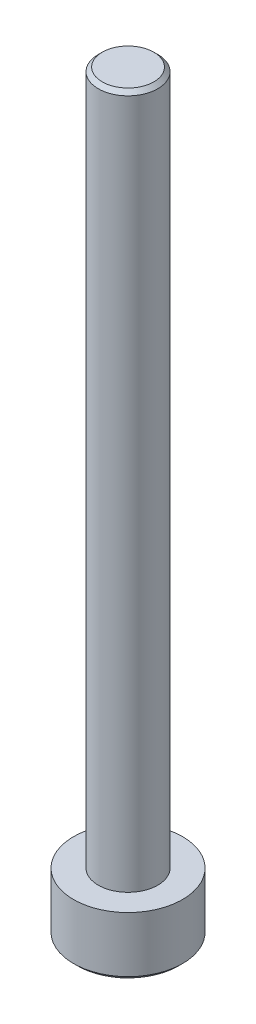
ISO-10303-21;
HEADER;
FILE_DESCRIPTION(('STEP AP214'),'2;1');
FILE_NAME('part.step','',(''),(''),'','','');
FILE_SCHEMA(('AUTOMOTIVE_DESIGN { 1 0 10303 214 1 1 1 1 }'));
ENDSEC;
DATA;
#1=APPLICATION_CONTEXT('core data for automotive mechanical design processes');
#2=APPLICATION_PROTOCOL_DEFINITION('international standard','automotive_design',2000,#1);
#3=PRODUCT_CONTEXT('',#1,'mechanical');
#4=PRODUCT('Part','Part','',(#3));
#5=PRODUCT_RELATED_PRODUCT_CATEGORY('part','',(#4));
#6=PRODUCT_DEFINITION_FORMATION('','',#4);
#7=PRODUCT_DEFINITION_CONTEXT('part definition',#1,'design');
#8=PRODUCT_DEFINITION('design','',#6,#7);
#9=PRODUCT_DEFINITION_SHAPE('','',#8);
#10=(LENGTH_UNIT() NAMED_UNIT(*) SI_UNIT(.MILLI.,.METRE.));
#11=(NAMED_UNIT(*) PLANE_ANGLE_UNIT() SI_UNIT($,.RADIAN.));
#12=(NAMED_UNIT(*) SI_UNIT($,.STERADIAN.) SOLID_ANGLE_UNIT());
#13=UNCERTAINTY_MEASURE_WITH_UNIT(LENGTH_MEASURE(1.E-05),#10,'distance_accuracy_value','');
#14=(GEOMETRIC_REPRESENTATION_CONTEXT(3) GLOBAL_UNCERTAINTY_ASSIGNED_CONTEXT((#13)) GLOBAL_UNIT_ASSIGNED_CONTEXT((#10,
#11,#12)) REPRESENTATION_CONTEXT('',''));
#15=CARTESIAN_POINT('',(0.,0.,0.));
#16=DIRECTION('',(0.,0.,1.));
#17=DIRECTION('',(1.,0.,0.));
#18=AXIS2_PLACEMENT_3D('',#15,#16,#17);
#19=CARTESIAN_POINT('',(0.,-3.,0.));
#20=DIRECTION('',(0.,-1.,0.));
#21=DIRECTION('',(0.,0.,-1.));
#22=AXIS2_PLACEMENT_3D('',#19,#20,#21);
#23=PLANE('',#22);
#24=CARTESIAN_POINT('',(0.,-3.,0.));
#25=DIRECTION('',(0.,-1.,0.));
#26=DIRECTION('',(0.,0.,-1.));
#27=AXIS2_PLACEMENT_3D('',#24,#25,#26);
#28=CIRCLE('',#27,2.55);
#29=CARTESIAN_POINT('',(0.,-3.,-2.55));
#30=VERTEX_POINT('',#29);
#31=EDGE_CURVE('E11',#30,#30,#28,.T.);
#32=ORIENTED_EDGE('',*,*,#31,.T.);
#33=EDGE_LOOP('',(#32));
#34=FACE_BOUND('',#33,.T.);
#35=DIRECTION('',(0.5,0.,-0.866025403784439));
#36=VECTOR('',#35,1.);
#37=CARTESIAN_POINT('',(1.44337567297406,-3.,0.));
#38=LINE('',#37,#36);
#39=CARTESIAN_POINT('',(0.721687836487032,-3.,1.25));
#40=VERTEX_POINT('',#39);
#41=CARTESIAN_POINT('',(1.44337567297406,-3.,0.));
#42=VERTEX_POINT('',#41);
#43=EDGE_CURVE('E127',#40,#42,#38,.T.);
#44=ORIENTED_EDGE('',*,*,#43,.T.);
#45=DIRECTION('',(-0.5,0.,-0.866025403784439));
#46=VECTOR('',#45,1.);
#47=CARTESIAN_POINT('',(0.721687836487032,-3.,-1.25));
#48=LINE('',#47,#46);
#49=CARTESIAN_POINT('',(0.721687836487032,-3.,-1.25));
#50=VERTEX_POINT('',#49);
#51=EDGE_CURVE('E47',#42,#50,#48,.T.);
#52=ORIENTED_EDGE('',*,*,#51,.T.);
#53=DIRECTION('',(-1.,0.,0.));
#54=VECTOR('',#53,1.);
#55=CARTESIAN_POINT('',(-0.721687836487033,-3.,-1.25));
#56=LINE('',#55,#54);
#57=CARTESIAN_POINT('',(-0.721687836487033,-3.,-1.25));
#58=VERTEX_POINT('',#57);
#59=EDGE_CURVE('E118',#50,#58,#56,.T.);
#60=ORIENTED_EDGE('',*,*,#59,.T.);
#61=DIRECTION('',(-0.5,0.,0.866025403784439));
#62=VECTOR('',#61,1.);
#63=CARTESIAN_POINT('',(-1.44337567297406,-3.,0.));
#64=LINE('',#63,#62);
#65=CARTESIAN_POINT('',(-1.44337567297406,-3.,0.));
#66=VERTEX_POINT('',#65);
#67=EDGE_CURVE('E121',#58,#66,#64,.T.);
#68=ORIENTED_EDGE('',*,*,#67,.T.);
#69=DIRECTION('',(0.5,0.,0.866025403784439));
#70=VECTOR('',#69,1.);
#71=CARTESIAN_POINT('',(-0.721687836487032,-3.,1.25));
#72=LINE('',#71,#70);
#73=CARTESIAN_POINT('',(-0.721687836487032,-3.,1.25));
#74=VERTEX_POINT('',#73);
#75=EDGE_CURVE('E124',#66,#74,#72,.T.);
#76=ORIENTED_EDGE('',*,*,#75,.T.);
#77=DIRECTION('',(1.,0.,0.));
#78=VECTOR('',#77,1.);
#79=CARTESIAN_POINT('',(0.721687836487032,-3.,1.25));
#80=LINE('',#79,#78);
#81=EDGE_CURVE('E108',#74,#40,#80,.T.);
#82=ORIENTED_EDGE('',*,*,#81,.T.);
#83=EDGE_LOOP('',(#44,#52,#60,#68,#76,#82));
#84=FACE_BOUND('',#83,.T.);
#85=ADVANCED_FACE('F33',(#34,#84),#23,.T.);
#86=CARTESIAN_POINT('',(0.,-3.,0.));
#87=DIRECTION('',(0.,1.,0.));
#88=DIRECTION('',(0.,0.,1.));
#89=AXIS2_PLACEMENT_3D('',#86,#87,#88);
#90=CONICAL_SURFACE('',#89,2.55,0.785398163397504);
#91=CARTESIAN_POINT('',(0.,-2.80000000000002,0.));
#92=DIRECTION('',(0.,-1.,0.));
#93=DIRECTION('',(0.,0.,-1.));
#94=AXIS2_PLACEMENT_3D('',#91,#92,#93);
#95=CIRCLE('',#94,2.75);
#96=CARTESIAN_POINT('',(0.,-2.80000000000002,-2.75));
#97=VERTEX_POINT('',#96);
#98=EDGE_CURVE('E40',#97,#97,#95,.T.);
#99=ORIENTED_EDGE('',*,*,#98,.T.);
#100=EDGE_LOOP('',(#99));
#101=FACE_BOUND('',#100,.T.);
#102=ORIENTED_EDGE('',*,*,#31,.F.);
#103=EDGE_LOOP('',(#102));
#104=FACE_BOUND('',#103,.T.);
#105=ADVANCED_FACE('F152',(#101,#104),#90,.T.);
#106=CARTESIAN_POINT('',(0.,-500.,0.));
#107=DIRECTION('',(0.,-1.,0.));
#108=DIRECTION('',(0.,0.,-1.));
#109=AXIS2_PLACEMENT_3D('',#106,#107,#108);
#110=CYLINDRICAL_SURFACE('',#109,2.75);
#111=CARTESIAN_POINT('',(0.,0.,0.));
#112=DIRECTION('',(0.,-1.,0.));
#113=DIRECTION('',(0.,0.,-1.));
#114=AXIS2_PLACEMENT_3D('',#111,#112,#113);
#115=CIRCLE('',#114,2.75);
#116=CARTESIAN_POINT('',(0.,0.,-2.75));
#117=VERTEX_POINT('',#116);
#118=EDGE_CURVE('E147',#117,#117,#115,.T.);
#119=ORIENTED_EDGE('',*,*,#118,.T.);
#120=EDGE_LOOP('',(#119));
#121=FACE_BOUND('',#120,.T.);
#122=ORIENTED_EDGE('',*,*,#98,.F.);
#123=EDGE_LOOP('',(#122));
#124=FACE_BOUND('',#123,.T.);
#125=ADVANCED_FACE('F155',(#121,#124),#110,.T.);
#126=CARTESIAN_POINT('',(2.75,0.,0.));
#127=DIRECTION('',(0.,1.,0.));
#128=DIRECTION('',(0.,0.,1.));
#129=AXIS2_PLACEMENT_3D('',#126,#127,#128);
#130=PLANE('',#129);
#131=CARTESIAN_POINT('',(0.,0.,0.));
#132=DIRECTION('',(0.,-1.,0.));
#133=DIRECTION('',(0.,0.,-1.));
#134=AXIS2_PLACEMENT_3D('',#131,#132,#133);
#135=CIRCLE('',#134,1.5);
#136=CARTESIAN_POINT('',(0.,0.,-1.5));
#137=VERTEX_POINT('',#136);
#138=EDGE_CURVE('E144',#137,#137,#135,.T.);
#139=ORIENTED_EDGE('',*,*,#138,.T.);
#140=EDGE_LOOP('',(#139));
#141=FACE_BOUND('',#140,.T.);
#142=ORIENTED_EDGE('',*,*,#118,.F.);
#143=EDGE_LOOP('',(#142));
#144=FACE_BOUND('',#143,.T.);
#145=ADVANCED_FACE('F157',(#141,#144),#130,.T.);
#146=CARTESIAN_POINT('',(0.,-500.,0.));
#147=DIRECTION('',(0.,-1.,0.));
#148=DIRECTION('',(0.,0.,-1.));
#149=AXIS2_PLACEMENT_3D('',#146,#147,#148);
#150=CYLINDRICAL_SURFACE('',#149,1.5);
#151=CARTESIAN_POINT('',(0.,34.7999999999999,0.));
#152=DIRECTION('',(0.,-1.,0.));
#153=DIRECTION('',(0.,0.,-1.));
#154=AXIS2_PLACEMENT_3D('',#151,#152,#153);
#155=CIRCLE('',#154,1.5);
#156=CARTESIAN_POINT('',(0.,34.7999999999999,-1.5));
#157=VERTEX_POINT('',#156);
#158=EDGE_CURVE('E141',#157,#157,#155,.T.);
#159=ORIENTED_EDGE('',*,*,#158,.T.);
#160=EDGE_LOOP('',(#159));
#161=FACE_BOUND('',#160,.T.);
#162=ORIENTED_EDGE('',*,*,#138,.F.);
#163=EDGE_LOOP('',(#162));
#164=FACE_BOUND('',#163,.T.);
#165=ADVANCED_FACE('F164',(#161,#164),#150,.T.);
#166=CARTESIAN_POINT('',(0.,34.7999999999999,0.));
#167=DIRECTION('',(0.,-1.,0.));
#168=DIRECTION('',(0.,0.,-1.));
#169=AXIS2_PLACEMENT_3D('',#166,#167,#168);
#170=CONICAL_SURFACE('',#169,1.5,0.785398163397226);
#171=CARTESIAN_POINT('',(0.,35.,0.));
#172=DIRECTION('',(0.,-1.,0.));
#173=DIRECTION('',(0.,0.,-1.));
#174=AXIS2_PLACEMENT_3D('',#171,#172,#173);
#175=CIRCLE('',#174,1.3);
#176=CARTESIAN_POINT('',(0.,35.,-1.3));
#177=VERTEX_POINT('',#176);
#178=EDGE_CURVE('E138',#177,#177,#175,.T.);
#179=ORIENTED_EDGE('',*,*,#178,.T.);
#180=EDGE_LOOP('',(#179));
#181=FACE_BOUND('',#180,.T.);
#182=ORIENTED_EDGE('',*,*,#158,.F.);
#183=EDGE_LOOP('',(#182));
#184=FACE_BOUND('',#183,.T.);
#185=ADVANCED_FACE('F197',(#181,#184),#170,.T.);
#186=CARTESIAN_POINT('',(1.3,35.,0.));
#187=DIRECTION('',(0.,1.,0.));
#188=DIRECTION('',(0.,0.,1.));
#189=AXIS2_PLACEMENT_3D('',#186,#187,#188);
#190=PLANE('',#189);
#191=ORIENTED_EDGE('',*,*,#178,.F.);
#192=EDGE_LOOP('',(#191));
#193=FACE_BOUND('',#192,.T.);
#194=ADVANCED_FACE('F191',(#193),#190,.T.);
#195=CARTESIAN_POINT('',(0.721687836487032,-1.5,-1.25));
#196=DIRECTION('',(-0.866025403784439,0.,0.5));
#197=DIRECTION('',(0.5,0.,0.866025403784439));
#198=AXIS2_PLACEMENT_3D('',#195,#196,#197);
#199=PLANE('',#198);
#200=ORIENTED_EDGE('',*,*,#51,.F.);
#201=DIRECTION('',(0.,-1.,0.));
#202=VECTOR('',#201,1.);
#203=CARTESIAN_POINT('',(1.44337567297406,-1.5,0.));
#204=LINE('',#203,#202);
#205=CARTESIAN_POINT('',(1.44337567297406,-1.5,0.));
#206=VERTEX_POINT('',#205);
#207=EDGE_CURVE('E113',#206,#42,#204,.T.);
#208=ORIENTED_EDGE('',*,*,#207,.F.);
#209=DIRECTION('',(-0.5,0.,-0.866025403784439));
#210=VECTOR('',#209,1.);
#211=CARTESIAN_POINT('',(0.721687836487032,-1.5,-1.25));
#212=LINE('',#211,#210);
#213=CARTESIAN_POINT('',(0.721687836487032,-1.5,-1.25));
#214=VERTEX_POINT('',#213);
#215=EDGE_CURVE('E130',#206,#214,#212,.T.);
#216=ORIENTED_EDGE('',*,*,#215,.T.);
#217=DIRECTION('',(0.,-1.,0.));
#218=VECTOR('',#217,1.);
#219=CARTESIAN_POINT('',(0.721687836487032,-1.5,-1.25));
#220=LINE('',#219,#218);
#221=EDGE_CURVE('E136',#214,#50,#220,.T.);
#222=ORIENTED_EDGE('',*,*,#221,.T.);
#223=EDGE_LOOP('',(#200,#208,#216,#222));
#224=FACE_BOUND('',#223,.T.);
#225=ADVANCED_FACE('F174',(#224),#199,.T.);
#226=CARTESIAN_POINT('',(-0.721687836487033,-1.5,-1.25));
#227=DIRECTION('',(0.,0.,1.));
#228=DIRECTION('',(1.,0.,0.));
#229=AXIS2_PLACEMENT_3D('',#226,#227,#228);
#230=PLANE('',#229);
#231=ORIENTED_EDGE('',*,*,#59,.F.);
#232=ORIENTED_EDGE('',*,*,#221,.F.);
#233=DIRECTION('',(-1.,0.,0.));
#234=VECTOR('',#233,1.);
#235=CARTESIAN_POINT('',(-0.721687836487033,-1.5,-1.25));
#236=LINE('',#235,#234);
#237=CARTESIAN_POINT('',(-0.721687836487033,-1.5,-1.25));
#238=VERTEX_POINT('',#237);
#239=EDGE_CURVE('E86',#214,#238,#236,.T.);
#240=ORIENTED_EDGE('',*,*,#239,.T.);
#241=DIRECTION('',(0.,-1.,0.));
#242=VECTOR('',#241,1.);
#243=CARTESIAN_POINT('',(-0.721687836487033,-1.5,-1.25));
#244=LINE('',#243,#242);
#245=EDGE_CURVE('E134',#238,#58,#244,.T.);
#246=ORIENTED_EDGE('',*,*,#245,.T.);
#247=EDGE_LOOP('',(#231,#232,#240,#246));
#248=FACE_BOUND('',#247,.T.);
#249=ADVANCED_FACE('F183',(#248),#230,.T.);
#250=CARTESIAN_POINT('',(-1.44337567297406,-1.5,0.));
#251=DIRECTION('',(0.866025403784439,0.,0.5));
#252=DIRECTION('',(0.5,0.,-0.866025403784439));
#253=AXIS2_PLACEMENT_3D('',#250,#251,#252);
#254=PLANE('',#253);
#255=ORIENTED_EDGE('',*,*,#67,.F.);
#256=ORIENTED_EDGE('',*,*,#245,.F.);
#257=DIRECTION('',(-0.5,0.,0.866025403784439));
#258=VECTOR('',#257,1.);
#259=CARTESIAN_POINT('',(-1.44337567297406,-1.5,0.));
#260=LINE('',#259,#258);
#261=CARTESIAN_POINT('',(-1.44337567297406,-1.5,0.));
#262=VERTEX_POINT('',#261);
#263=EDGE_CURVE('E104',#238,#262,#260,.T.);
#264=ORIENTED_EDGE('',*,*,#263,.T.);
#265=DIRECTION('',(0.,-1.,0.));
#266=VECTOR('',#265,1.);
#267=CARTESIAN_POINT('',(-1.44337567297406,-1.5,0.));
#268=LINE('',#267,#266);
#269=EDGE_CURVE('E101',#262,#66,#268,.T.);
#270=ORIENTED_EDGE('',*,*,#269,.T.);
#271=EDGE_LOOP('',(#255,#256,#264,#270));
#272=FACE_BOUND('',#271,.T.);
#273=ADVANCED_FACE('F181',(#272),#254,.T.);
#274=CARTESIAN_POINT('',(-0.721687836487032,-1.5,1.25));
#275=DIRECTION('',(0.866025403784438,0.,-0.5));
#276=DIRECTION('',(-0.5,0.,-0.866025403784439));
#277=AXIS2_PLACEMENT_3D('',#274,#275,#276);
#278=PLANE('',#277);
#279=ORIENTED_EDGE('',*,*,#75,.F.);
#280=ORIENTED_EDGE('',*,*,#269,.F.);
#281=DIRECTION('',(0.5,0.,0.866025403784439));
#282=VECTOR('',#281,1.);
#283=CARTESIAN_POINT('',(-0.721687836487032,-1.5,1.25));
#284=LINE('',#283,#282);
#285=CARTESIAN_POINT('',(-0.721687836487032,-1.5,1.25));
#286=VERTEX_POINT('',#285);
#287=EDGE_CURVE('E96',#262,#286,#284,.T.);
#288=ORIENTED_EDGE('',*,*,#287,.T.);
#289=DIRECTION('',(0.,-1.,0.));
#290=VECTOR('',#289,1.);
#291=CARTESIAN_POINT('',(-0.721687836487032,-1.5,1.25));
#292=LINE('',#291,#290);
#293=EDGE_CURVE('E100',#286,#74,#292,.T.);
#294=ORIENTED_EDGE('',*,*,#293,.T.);
#295=EDGE_LOOP('',(#279,#280,#288,#294));
#296=FACE_BOUND('',#295,.T.);
#297=ADVANCED_FACE('F99',(#296),#278,.T.);
#298=CARTESIAN_POINT('',(0.721687836487032,-1.5,1.25));
#299=DIRECTION('',(0.,0.,-1.));
#300=DIRECTION('',(-1.,0.,0.));
#301=AXIS2_PLACEMENT_3D('',#298,#299,#300);
#302=PLANE('',#301);
#303=ORIENTED_EDGE('',*,*,#81,.F.);
#304=ORIENTED_EDGE('',*,*,#293,.F.);
#305=DIRECTION('',(1.,0.,0.));
#306=VECTOR('',#305,1.);
#307=CARTESIAN_POINT('',(0.721687836487032,-1.5,1.25));
#308=LINE('',#307,#306);
#309=CARTESIAN_POINT('',(0.721687836487032,-1.5,1.25));
#310=VERTEX_POINT('',#309);
#311=EDGE_CURVE('E103',#286,#310,#308,.T.);
#312=ORIENTED_EDGE('',*,*,#311,.T.);
#313=DIRECTION('',(0.,-1.,0.));
#314=VECTOR('',#313,1.);
#315=CARTESIAN_POINT('',(0.721687836487032,-1.5,1.25));
#316=LINE('',#315,#314);
#317=EDGE_CURVE('E77',#310,#40,#316,.T.);
#318=ORIENTED_EDGE('',*,*,#317,.T.);
#319=EDGE_LOOP('',(#303,#304,#312,#318));
#320=FACE_BOUND('',#319,.T.);
#321=ADVANCED_FACE('F106',(#320),#302,.T.);
#322=CARTESIAN_POINT('',(1.44337567297406,-1.5,0.));
#323=DIRECTION('',(-0.866025403784439,0.,-0.5));
#324=DIRECTION('',(-0.5,0.,0.866025403784439));
#325=AXIS2_PLACEMENT_3D('',#322,#323,#324);
#326=PLANE('',#325);
#327=ORIENTED_EDGE('',*,*,#43,.F.);
#328=ORIENTED_EDGE('',*,*,#317,.F.);
#329=DIRECTION('',(0.5,0.,-0.866025403784439));
#330=VECTOR('',#329,1.);
#331=CARTESIAN_POINT('',(1.44337567297406,-1.5,0.));
#332=LINE('',#331,#330);
#333=EDGE_CURVE('E55',#310,#206,#332,.T.);
#334=ORIENTED_EDGE('',*,*,#333,.T.);
#335=ORIENTED_EDGE('',*,*,#207,.T.);
#336=EDGE_LOOP('',(#327,#328,#334,#335));
#337=FACE_BOUND('',#336,.T.);
#338=ADVANCED_FACE('F173',(#337),#326,.T.);
#339=CARTESIAN_POINT('',(0.,-1.5,0.));
#340=DIRECTION('',(0.,-1.,0.));
#341=DIRECTION('',(0.,0.,-1.));
#342=AXIS2_PLACEMENT_3D('',#339,#340,#341);
#343=PLANE('',#342);
#344=ORIENTED_EDGE('',*,*,#215,.F.);
#345=ORIENTED_EDGE('',*,*,#333,.F.);
#346=ORIENTED_EDGE('',*,*,#311,.F.);
#347=ORIENTED_EDGE('',*,*,#287,.F.);
#348=ORIENTED_EDGE('',*,*,#263,.F.);
#349=ORIENTED_EDGE('',*,*,#239,.F.);
#350=EDGE_LOOP('',(#344,#345,#346,#347,#348,#349));
#351=FACE_BOUND('',#350,.T.);
#352=ADVANCED_FACE('F111',(#351),#343,.T.);
#353=CLOSED_SHELL('',(#85,#105,#125,#145,#165,#185,#194,#225,#249,#273,#297,#321,#338,#352));
#354=MANIFOLD_SOLID_BREP('B2',#353);
#355=ADVANCED_BREP_SHAPE_REPRESENTATION('',(#18,#354),#14);
#356=SHAPE_DEFINITION_REPRESENTATION(#9,#355);
ENDSEC;
END-ISO-10303-21;
